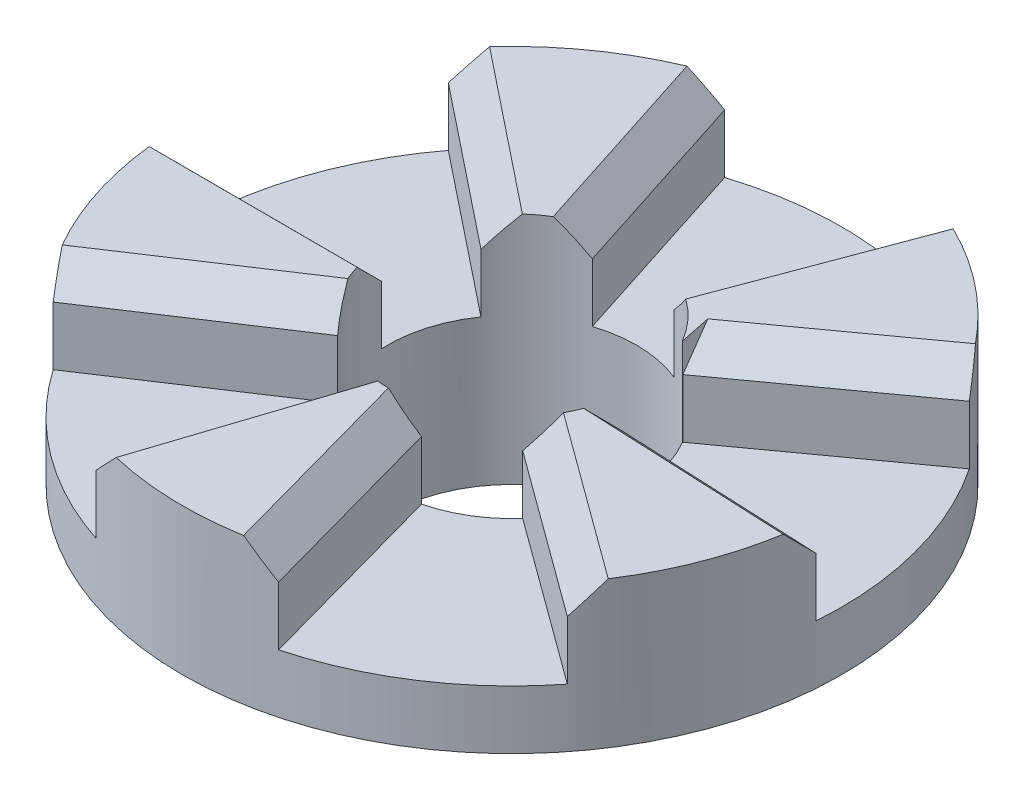
ISO-10303-21;
HEADER;
FILE_DESCRIPTION(('STEP AP214'),'2;1');
FILE_NAME('part.step','',(''),(''),'','','');
FILE_SCHEMA(('AUTOMOTIVE_DESIGN { 1 0 10303 214 1 1 1 1 }'));
ENDSEC;
DATA;
#1=APPLICATION_CONTEXT('core data for automotive mechanical design processes');
#2=APPLICATION_PROTOCOL_DEFINITION('international standard','automotive_design',2000,#1);
#3=PRODUCT_CONTEXT('',#1,'mechanical');
#4=PRODUCT('Part','Part','',(#3));
#5=PRODUCT_RELATED_PRODUCT_CATEGORY('part','',(#4));
#6=PRODUCT_DEFINITION_FORMATION('','',#4);
#7=PRODUCT_DEFINITION_CONTEXT('part definition',#1,'design');
#8=PRODUCT_DEFINITION('design','',#6,#7);
#9=PRODUCT_DEFINITION_SHAPE('','',#8);
#10=(LENGTH_UNIT() NAMED_UNIT(*) SI_UNIT(.MILLI.,.METRE.));
#11=(NAMED_UNIT(*) PLANE_ANGLE_UNIT() SI_UNIT($,.RADIAN.));
#12=(NAMED_UNIT(*) SI_UNIT($,.STERADIAN.) SOLID_ANGLE_UNIT());
#13=UNCERTAINTY_MEASURE_WITH_UNIT(LENGTH_MEASURE(1.E-05),#10,'distance_accuracy_value','');
#14=(GEOMETRIC_REPRESENTATION_CONTEXT(3) GLOBAL_UNCERTAINTY_ASSIGNED_CONTEXT((#13)) GLOBAL_UNIT_ASSIGNED_CONTEXT((#10,
#11,#12)) REPRESENTATION_CONTEXT('',''));
#15=CARTESIAN_POINT('',(0.,0.,0.));
#16=DIRECTION('',(0.,0.,1.));
#17=DIRECTION('',(1.,0.,0.));
#18=AXIS2_PLACEMENT_3D('',#15,#16,#17);
#19=CARTESIAN_POINT('',(0.,0.,0.));
#20=DIRECTION('',(0.,1.,0.));
#21=DIRECTION('',(0.,0.,1.));
#22=AXIS2_PLACEMENT_3D('',#19,#20,#21);
#23=PLANE('',#22);
#24=CARTESIAN_POINT('',(0.,0.,0.));
#25=DIRECTION('',(0.,1.,0.));
#26=DIRECTION('',(0.,0.,1.));
#27=AXIS2_PLACEMENT_3D('',#24,#25,#26);
#28=CIRCLE('',#27,11.25);
#29=CARTESIAN_POINT('',(0.,0.,11.25));
#30=VERTEX_POINT('',#29);
#31=EDGE_CURVE('E364',#30,#30,#28,.T.);
#32=ORIENTED_EDGE('',*,*,#31,.F.);
#33=EDGE_LOOP('',(#32));
#34=FACE_BOUND('',#33,.T.);
#35=CARTESIAN_POINT('',(0.,0.,0.));
#36=DIRECTION('',(0.,1.,0.));
#37=DIRECTION('',(0.,0.,1.));
#38=AXIS2_PLACEMENT_3D('',#35,#36,#37);
#39=CIRCLE('',#38,6.62076451720031);
#40=CARTESIAN_POINT('',(0.,0.,6.62076451720031));
#41=VERTEX_POINT('',#40);
#42=EDGE_CURVE('E390',#41,#41,#39,.F.);
#43=ORIENTED_EDGE('',*,*,#42,.F.);
#44=EDGE_LOOP('',(#43));
#45=FACE_BOUND('',#44,.T.);
#46=ADVANCED_FACE('F39',(#34,#45),#23,.F.);
#47=CARTESIAN_POINT('',(0.,5.,0.));
#48=DIRECTION('',(0.,1.,0.));
#49=DIRECTION('',(0.,0.,1.));
#50=AXIS2_PLACEMENT_3D('',#47,#48,#49);
#51=PLANE('',#50);
#52=CARTESIAN_POINT('',(0.,5.,0.));
#53=DIRECTION('',(0.,1.,0.));
#54=DIRECTION('',(0.,0.,1.));
#55=AXIS2_PLACEMENT_3D('',#52,#53,#54);
#56=CIRCLE('',#55,4.25);
#57=CARTESIAN_POINT('',(-2.21772566269863,5.,-3.62549208866989));
#58=VERTEX_POINT('',#57);
#59=CARTESIAN_POINT('',(-2.82302044816182,5.,-3.17695696370918));
#60=VERTEX_POINT('',#59);
#61=EDGE_CURVE('E494',#58,#60,#56,.T.);
#62=ORIENTED_EDGE('',*,*,#61,.F.);
#63=DIRECTION('',(-0.306448072952789,0.,-0.951887377048106));
#64=VECTOR('',#63,1.);
#65=CARTESIAN_POINT('',(-4.39942819776698,5.,-10.4022849188384));
#66=LINE('',#65,#64);
#67=CARTESIAN_POINT('',(-4.38578127306564,5.,-10.3598949137926));
#68=VERTEX_POINT('',#67);
#69=EDGE_CURVE('E423',#58,#68,#66,.T.);
#70=ORIENTED_EDGE('',*,*,#69,.T.);
#71=CARTESIAN_POINT('',(0.,5.,0.));
#72=DIRECTION('',(0.,1.,0.));
#73=DIRECTION('',(0.,0.,1.));
#74=AXIS2_PLACEMENT_3D('',#71,#72,#73);
#75=CIRCLE('',#74,11.25);
#76=CARTESIAN_POINT('',(-8.32818321159797,5.,-7.56332363409485));
#77=VERTEX_POINT('',#76);
#78=EDGE_CURVE('E369',#68,#77,#75,.T.);
#79=ORIENTED_EDGE('',*,*,#78,.T.);
#80=DIRECTION('',(0.782098318227316,0.,0.623155053438551));
#81=VECTOR('',#80,1.);
#82=CARTESIAN_POINT('',(-2.86487094044204,5.,-3.21030231830913));
#83=LINE('',#82,#81);
#84=EDGE_CURVE('E421',#77,#60,#83,.T.);
#85=ORIENTED_EDGE('',*,*,#84,.T.);
#86=EDGE_LOOP('',(#62,#70,#79,#85));
#87=FACE_BOUND('',#86,.T.);
#88=ADVANCED_FACE('F573',(#87),#51,.T.);
#89=CARTESIAN_POINT('',(-4.07181346345306,5.,1.21771717522682));
#90=VERTEX_POINT('',#89);
#91=CARTESIAN_POINT('',(-3.89120805293024,5.,1.70909329435547));
#92=VERTEX_POINT('',#91);
#93=EDGE_CURVE('E496',#90,#92,#56,.T.);
#94=ORIENTED_EDGE('',*,*,#93,.F.);
#95=DIRECTION('',(-0.999996355156568,0.,-0.00269993955101534));
#96=VECTOR('',#95,1.);
#97=CARTESIAN_POINT('',(-11.2509514584231,5.,1.19833386596288));
#98=LINE('',#97,#96);
#99=CARTESIAN_POINT('',(-11.1859767329973,5.,1.19850929443328));
#100=VERTEX_POINT('',#99);
#101=EDGE_CURVE('E451',#90,#100,#98,.T.);
#102=ORIENTED_EDGE('',*,*,#101,.T.);
#103=CARTESIAN_POINT('',(-9.76349954933888,5.,5.58896918492664));
#104=VERTEX_POINT('',#103);
#105=EDGE_CURVE('E366',#100,#104,#75,.T.);
#106=ORIENTED_EDGE('',*,*,#105,.T.);
#107=DIRECTION('',(0.834337345839295,0.,-0.551254200290429));
#108=VECTOR('',#107,1.);
#109=CARTESIAN_POINT('',(-3.93457760302221,5.,1.73774794678368));
#110=LINE('',#109,#108);
#111=EDGE_CURVE('E449',#104,#92,#110,.T.);
#112=ORIENTED_EDGE('',*,*,#111,.T.);
#113=EDGE_LOOP('',(#94,#102,#106,#112));
#114=FACE_BOUND('',#113,.T.);
#115=ADVANCED_FACE('F557',(#114),#51,.T.);
#116=CARTESIAN_POINT('',(-0.354113646197258,5.,4.23522177997527));
#117=VERTEX_POINT('',#116);
#118=CARTESIAN_POINT('',(0.0326870897609603,5.,4.24987429863084));
#119=VERTEX_POINT('',#118);
#120=EDGE_CURVE('E361',#117,#119,#56,.T.);
#121=ORIENTED_EDGE('',*,*,#120,.F.);
#122=DIRECTION('',(-0.311583663159981,0.,0.950218722638008));
#123=VECTOR('',#122,1.);
#124=CARTESIAN_POINT('',(-2.57111376427981,5.,10.9962791439202));
#125=LINE('',#124,#123);
#126=CARTESIAN_POINT('',(-2.55770689382485,5.,10.9553929845205));
#127=VERTEX_POINT('',#126);
#128=EDGE_CURVE('E461',#117,#127,#125,.T.);
#129=ORIENTED_EDGE('',*,*,#128,.T.);
#130=CARTESIAN_POINT('',(1.92209670396127,5.,11.0845858858426));
#131=VERTEX_POINT('',#130);
#132=EDGE_CURVE('E370',#127,#131,#75,.T.);
#133=ORIENTED_EDGE('',*,*,#132,.T.);
#134=DIRECTION('',(-0.266449480415256,0.,-0.963848885659179));
#135=VECTOR('',#134,1.);
#136=CARTESIAN_POINT('',(0.071017633608241,5.,4.3885304217966));
#137=LINE('',#136,#135);
#138=EDGE_CURVE('E459',#131,#119,#137,.T.);
#139=ORIENTED_EDGE('',*,*,#138,.T.);
#140=EDGE_LOOP('',(#121,#129,#133,#139));
#141=FACE_BOUND('',#140,.T.);
#142=ADVANCED_FACE('F535',(#141),#51,.T.);
#143=CARTESIAN_POINT('',(3.75244163910729,5.,1.99541518113245));
#144=VERTEX_POINT('',#143);
#145=CARTESIAN_POINT('',(3.96846718508751,5.,1.52110755730278));
#146=VERTEX_POINT('',#145);
#147=EDGE_CURVE('E362',#144,#146,#56,.T.);
#148=ORIENTED_EDGE('',*,*,#147,.F.);
#149=DIRECTION('',(0.807427060984501,0.,0.589967406887814));
#150=VECTOR('',#149,1.);
#151=CARTESIAN_POINT('',(9.43344057354921,5.,6.14638357423845));
#152=LINE('',#151,#150);
#153=CARTESIAN_POINT('',(9.42606450171558,5.,6.14099405711302));
#154=VERTEX_POINT('',#153);
#155=EDGE_CURVE('E471',#144,#154,#152,.T.);
#156=ORIENTED_EDGE('',*,*,#155,.T.);
#157=CARTESIAN_POINT('',(11.0987951756031,5.,1.83827246348546));
#158=VERTEX_POINT('',#157);
#159=EDGE_CURVE('E374',#154,#158,#75,.T.);
#160=ORIENTED_EDGE('',*,*,#159,.T.);
#161=DIRECTION('',(-0.999012181020673,0.,-0.0444371710656552));
#162=VECTOR('',#161,1.);
#163=CARTESIAN_POINT('',(4.17224039011066,5.,1.53017161572193));
#164=LINE('',#163,#162);
#165=EDGE_CURVE('E469',#158,#146,#164,.T.);
#166=ORIENTED_EDGE('',*,*,#165,.T.);
#167=EDGE_LOOP('',(#148,#156,#160,#166));
#168=FACE_BOUND('',#167,.T.);
#169=ADVANCED_FACE('F529',(#168),#51,.T.);
#170=DIRECTION('',(0.200951340605031,0.,0.979601224330105));
#171=VECTOR('',#170,1.);
#172=CARTESIAN_POINT('',(3.66281976973587,5.,-2.16879652959475));
#173=LINE('',#172,#171);
#174=CARTESIAN_POINT('',(3.44241618830375,5.,-3.24322388881304));
#175=VERTEX_POINT('',#174);
#176=CARTESIAN_POINT('',(3.66700674187715,5.,-2.14838580218441));
#177=VERTEX_POINT('',#176);
#178=EDGE_CURVE('E55',#175,#177,#173,.T.);
#179=ORIENTED_EDGE('',*,*,#178,.F.);
#180=DIRECTION('',(0.810601030284837,0.,-0.5855988129267));
#181=VECTOR('',#180,1.);
#182=CARTESIAN_POINT('',(8.75484439008049,5.,-7.08105721555532));
#183=LINE('',#182,#181);
#184=CARTESIAN_POINT('',(8.74668769813831,5.,-7.07516461372003));
#185=VERTEX_POINT('',#184);
#186=EDGE_CURVE('E48',#175,#185,#183,.T.);
#187=ORIENTED_EDGE('',*,*,#186,.T.);
#188=CARTESIAN_POINT('',(4.96972684778681,5.,-10.0927852973491));
#189=VERTEX_POINT('',#188);
#190=EDGE_CURVE('E478',#185,#189,#75,.T.);
#191=ORIENTED_EDGE('',*,*,#190,.T.);
#192=DIRECTION('',(-0.350974002630683,0.,0.93638520357671));
#193=VECTOR('',#192,1.);
#194=CARTESIAN_POINT('',(2.53170816625464,5.,-3.58824478346796));
#195=LINE('',#194,#193);
#196=CARTESIAN_POINT('',(2.48032529787942,5.,-3.45115725760206));
#197=VERTEX_POINT('',#196);
#198=EDGE_CURVE('E399',#189,#197,#195,.T.);
#199=ORIENTED_EDGE('',*,*,#198,.T.);
#200=EDGE_CURVE('E365',#177,#197,#56,.T.);
#201=ORIENTED_EDGE('',*,*,#200,.F.);
#202=EDGE_LOOP('',(#179,#187,#191,#199,#201));
#203=FACE_BOUND('',#202,.T.);
#204=ADVANCED_FACE('F477',(#203),#51,.T.);
#205=CARTESIAN_POINT('',(0.,5.,0.));
#206=DIRECTION('',(0.,-1.,0.));
#207=DIRECTION('',(0.,0.,-1.));
#208=AXIS2_PLACEMENT_3D('',#205,#206,#207);
#209=CYLINDRICAL_SURFACE('',#208,11.25);
#210=ORIENTED_EDGE('',*,*,#78,.F.);
#211=CARTESIAN_POINT('',(0.,4.00000000000001,0.));
#212=DIRECTION('',(0.673086019236589,0.70710678118655,-0.216691510466466));
#213=DIRECTION('',(0.673086019236594,-0.707106781186545,-0.216691510466467));
#214=AXIS2_PLACEMENT_3D('',#211,#212,#213);
#215=ELLIPSE('',#214,15.9099025766973,11.25);
#216=CARTESIAN_POINT('',(-3.44754082071887,4.,-10.7087329917912));
#217=VERTEX_POINT('',#216);
#218=EDGE_CURVE('E441',#68,#217,#215,.F.);
#219=ORIENTED_EDGE('',*,*,#218,.T.);
#220=DIRECTION('',(0.,1.,0.));
#221=VECTOR('',#220,1.);
#222=CARTESIAN_POINT('',(-3.44754082071887,2.,-10.7087329917912));
#223=LINE('',#222,#221);
#224=CARTESIAN_POINT('',(-3.44754082071887,2.,-10.7087329917912));
#225=VERTEX_POINT('',#224);
#226=EDGE_CURVE('E321',#225,#217,#223,.T.);
#227=ORIENTED_EDGE('',*,*,#226,.F.);
#228=CARTESIAN_POINT('',(0.,2.,0.));
#229=DIRECTION('',(0.,1.,0.));
#230=DIRECTION('',(0.,0.,1.));
#231=AXIS2_PLACEMENT_3D('',#228,#229,#230);
#232=CIRCLE('',#231,11.25);
#233=CARTESIAN_POINT('',(4.05245917928113,2.,-10.4947641517216));
#234=VERTEX_POINT('',#233);
#235=EDGE_CURVE('E325',#234,#225,#232,.T.);
#236=ORIENTED_EDGE('',*,*,#235,.F.);
#237=DIRECTION('',(0.,1.,0.));
#238=VECTOR('',#237,1.);
#239=CARTESIAN_POINT('',(4.05245917928113,2.,-10.4947641517216));
#240=LINE('',#239,#238);
#241=CARTESIAN_POINT('',(4.05245917928113,4.,-10.4947641517216));
#242=VERTEX_POINT('',#241);
#243=EDGE_CURVE('E322',#234,#242,#240,.T.);
#244=ORIENTED_EDGE('',*,*,#243,.T.);
#245=CARTESIAN_POINT('',(0.,3.88872656741725,0.));
#246=DIRECTION('',(-0.662124327251836,0.707106781186549,-0.248176097280341));
#247=DIRECTION('',(-0.662124327251839,-0.707106781186546,-0.248176097280342));
#248=AXIS2_PLACEMENT_3D('',#245,#246,#247);
#249=ELLIPSE('',#248,15.9099025766973,11.25);
#250=EDGE_CURVE('E396',#242,#189,#249,.F.);
#251=ORIENTED_EDGE('',*,*,#250,.T.);
#252=ORIENTED_EDGE('',*,*,#190,.F.);
#253=CARTESIAN_POINT('',(0.,4.38691420775409,0.));
#254=DIRECTION('',(0.414080891675262,0.707106781186548,0.57318148535121));
#255=DIRECTION('',(0.414080891675263,-0.707106781186547,0.573181485351211));
#256=AXIS2_PLACEMENT_3D('',#253,#254,#255);
#257=ELLIPSE('',#256,15.9099025766973,11.25);
#258=CARTESIAN_POINT('',(9.34044320300719,4.,-6.27045618527048));
#259=VERTEX_POINT('',#258);
#260=EDGE_CURVE('E425',#185,#259,#257,.F.);
#261=ORIENTED_EDGE('',*,*,#260,.T.);
#262=DIRECTION('',(0.,-1.,0.));
#263=VECTOR('',#262,1.);
#264=CARTESIAN_POINT('',(9.34044320300719,5.,-6.27045618527048));
#265=LINE('',#264,#263);
#266=CARTESIAN_POINT('',(9.34044320300719,2.,-6.27045618527048));
#267=VERTEX_POINT('',#266);
#268=EDGE_CURVE('E388',#259,#267,#265,.T.);
#269=ORIENTED_EDGE('',*,*,#268,.T.);
#270=CARTESIAN_POINT('',(0.,2.,0.));
#271=DIRECTION('',(0.,1.,0.));
#272=DIRECTION('',(0.,0.,1.));
#273=AXIS2_PLACEMENT_3D('',#270,#271,#272);
#274=CIRCLE('',#273,11.25);
#275=CARTESIAN_POINT('',(11.218400898962,2.,0.842603863134233));
#276=VERTEX_POINT('',#275);
#277=EDGE_CURVE('E334',#276,#267,#274,.T.);
#278=ORIENTED_EDGE('',*,*,#277,.F.);
#279=DIRECTION('',(0.,-1.,0.));
#280=VECTOR('',#279,1.);
#281=CARTESIAN_POINT('',(11.218400898962,5.,0.842603863134233));
#282=LINE('',#281,#280);
#283=CARTESIAN_POINT('',(11.218400898962,4.,0.842603863134233));
#284=VERTEX_POINT('',#283);
#285=EDGE_CURVE('E264',#276,#284,#282,.F.);
#286=ORIENTED_EDGE('',*,*,#285,.T.);
#287=CARTESIAN_POINT('',(0.,3.6567424767841,0.));
#288=DIRECTION('',(0.0314218249972714,0.707106781186549,-0.706408287687679));
#289=DIRECTION('',(0.0314218249972715,-0.707106781186546,-0.706408287687682));
#290=AXIS2_PLACEMENT_3D('',#287,#288,#289);
#291=ELLIPSE('',#290,15.9099025766973,11.25);
#292=EDGE_CURVE('E427',#284,#158,#291,.F.);
#293=ORIENTED_EDGE('',*,*,#292,.T.);
#294=ORIENTED_EDGE('',*,*,#159,.F.);
#295=CARTESIAN_POINT('',(0.,4.39733395182365,0.));
#296=DIRECTION('',(-0.417169954089415,0.707106781186549,0.570937150135664));
#297=DIRECTION('',(-0.417169954089417,-0.707106781186546,0.570937150135666));
#298=AXIS2_PLACEMENT_3D('',#295,#296,#297);
#299=ELLIPSE('',#298,15.9099025766973,11.25);
#300=CARTESIAN_POINT('',(8.8434731666614,4.,6.95381063522296));
#301=VERTEX_POINT('',#300);
#302=EDGE_CURVE('E429',#154,#301,#299,.F.);
#303=ORIENTED_EDGE('',*,*,#302,.T.);
#304=DIRECTION('',(0.,-1.,0.));
#305=VECTOR('',#304,1.);
#306=CARTESIAN_POINT('',(8.8434731666614,5.,6.95381063522296));
#307=LINE('',#306,#305);
#308=CARTESIAN_POINT('',(8.84347316666139,2.,6.95381063522295));
#309=VERTEX_POINT('',#308);
#310=EDGE_CURVE('E340',#301,#309,#307,.T.);
#311=ORIENTED_EDGE('',*,*,#310,.T.);
#312=CARTESIAN_POINT('',(0.,2.,0.));
#313=DIRECTION('',(0.,1.,0.));
#314=DIRECTION('',(0.,0.,1.));
#315=AXIS2_PLACEMENT_3D('',#312,#313,#314);
#316=CIRCLE('',#315,11.25);
#317=CARTESIAN_POINT('',(2.90021138671235,2.,10.8697412072406));
#318=VERTEX_POINT('',#317);
#319=EDGE_CURVE('E337',#318,#309,#316,.T.);
#320=ORIENTED_EDGE('',*,*,#319,.F.);
#321=DIRECTION('',(0.,-1.,0.));
#322=VECTOR('',#321,1.);
#323=CARTESIAN_POINT('',(2.90021138671235,5.,10.8697412072406));
#324=LINE('',#323,#322);
#325=CARTESIAN_POINT('',(2.90021138671235,4.,10.8697412072406));
#326=VERTEX_POINT('',#325);
#327=EDGE_CURVE('E342',#318,#326,#324,.F.);
#328=ORIENTED_EDGE('',*,*,#327,.T.);
#329=CARTESIAN_POINT('',(0.,3.89912861634121,0.));
#330=DIRECTION('',(0.681544083088702,0.707106781186548,-0.188408234445259));
#331=DIRECTION('',(0.681544083088703,-0.707106781186547,-0.188408234445259));
#332=AXIS2_PLACEMENT_3D('',#329,#330,#331);
#333=ELLIPSE('',#332,15.9099025766973,11.25);
#334=EDGE_CURVE('E431',#326,#131,#333,.F.);
#335=ORIENTED_EDGE('',*,*,#334,.T.);
#336=ORIENTED_EDGE('',*,*,#132,.F.);
#337=CARTESIAN_POINT('',(0.,4.01685950005862,0.));
#338=DIRECTION('',(-0.671906102387752,0.70710678118655,-0.220322921127367));
#339=DIRECTION('',(-0.671906102387757,-0.707106781186545,-0.220322921127369));
#340=AXIS2_PLACEMENT_3D('',#337,#338,#339);
#341=ELLIPSE('',#340,15.9099025766973,11.25);
#342=CARTESIAN_POINT('',(-3.52133248691783,4.,10.6846954807602));
#343=VERTEX_POINT('',#342);
#344=EDGE_CURVE('E433',#127,#343,#341,.F.);
#345=ORIENTED_EDGE('',*,*,#344,.T.);
#346=DIRECTION('',(0.,-1.,0.));
#347=VECTOR('',#346,1.);
#348=CARTESIAN_POINT('',(-3.52133248691783,5.,10.6846954807602));
#349=LINE('',#348,#347);
#350=CARTESIAN_POINT('',(-3.52133248691783,2.,10.6846954807602));
#351=VERTEX_POINT('',#350);
#352=EDGE_CURVE('E348',#343,#351,#349,.T.);
#353=ORIENTED_EDGE('',*,*,#352,.T.);
#354=CARTESIAN_POINT('',(0.,2.,0.));
#355=DIRECTION('',(0.,1.,0.));
#356=DIRECTION('',(0.,0.,1.));
#357=AXIS2_PLACEMENT_3D('',#354,#355,#356);
#358=CIRCLE('',#357,11.25);
#359=CARTESIAN_POINT('',(-9.22851254532332,2.,6.43405441388322));
#360=VERTEX_POINT('',#359);
#361=EDGE_CURVE('E345',#360,#351,#358,.T.);
#362=ORIENTED_EDGE('',*,*,#361,.F.);
#363=DIRECTION('',(0.,-1.,0.));
#364=VECTOR('',#363,1.);
#365=CARTESIAN_POINT('',(-9.22851254532332,5.,6.43405441388322));
#366=LINE('',#365,#364);
#367=CARTESIAN_POINT('',(-9.22851254532332,4.,6.43405441388322));
#368=VERTEX_POINT('',#367);
#369=EDGE_CURVE('E350',#360,#368,#366,.F.);
#370=ORIENTED_EDGE('',*,*,#369,.T.);
#371=CARTESIAN_POINT('',(0.,4.28091557962254,0.));
#372=DIRECTION('',(0.389795583182929,0.707106781186548,0.589965595040151));
#373=DIRECTION('',(0.38979558318293,-0.707106781186547,0.589965595040152));
#374=AXIS2_PLACEMENT_3D('',#371,#372,#373);
#375=ELLIPSE('',#374,15.9099025766973,11.25);
#376=EDGE_CURVE('E435',#368,#104,#375,.F.);
#377=ORIENTED_EDGE('',*,*,#376,.T.);
#378=ORIENTED_EDGE('',*,*,#105,.F.);
#379=CARTESIAN_POINT('',(0.,3.7712936129473,0.));
#380=DIRECTION('',(0.0019091455653167,0.70710678118655,-0.707104203893038));
#381=DIRECTION('',(0.00190914556531672,-0.707106781186545,-0.707104203893043));
#382=AXIS2_PLACEMENT_3D('',#379,#380,#381);
#383=ELLIPSE('',#382,15.9099025766973,11.25);
#384=CARTESIAN_POINT('',(-11.248251518872,4.,0.198337510806303));
#385=VERTEX_POINT('',#384);
#386=EDGE_CURVE('E437',#100,#385,#383,.F.);
#387=ORIENTED_EDGE('',*,*,#386,.T.);
#388=DIRECTION('',(0.,-1.,0.));
#389=VECTOR('',#388,1.);
#390=CARTESIAN_POINT('',(-11.248251518872,5.,0.198337510806303));
#391=LINE('',#390,#389);
#392=CARTESIAN_POINT('',(-11.248251518872,2.,0.198337510806303));
#393=VERTEX_POINT('',#392);
#394=EDGE_CURVE('E356',#385,#393,#391,.T.);
#395=ORIENTED_EDGE('',*,*,#394,.T.);
#396=CARTESIAN_POINT('',(0.,2.,0.));
#397=DIRECTION('',(0.,1.,0.));
#398=DIRECTION('',(0.,0.,1.));
#399=AXIS2_PLACEMENT_3D('',#396,#397,#398);
#400=CIRCLE('',#399,11.25);
#401=CARTESIAN_POINT('',(-8.96703458527312,2.,-6.79373172464999));
#402=VERTEX_POINT('',#401);
#403=EDGE_CURVE('E353',#402,#393,#400,.T.);
#404=ORIENTED_EDGE('',*,*,#403,.F.);
#405=DIRECTION('',(0.,-1.,0.));
#406=VECTOR('',#405,1.);
#407=CARTESIAN_POINT('',(-8.96703458527312,5.,-6.79373172464999));
#408=LINE('',#407,#406);
#409=CARTESIAN_POINT('',(-8.96703458527312,4.,-6.79373172464999));
#410=VERTEX_POINT('',#409);
#411=EDGE_CURVE('E358',#402,#410,#408,.F.);
#412=ORIENTED_EDGE('',*,*,#411,.T.);
#413=CARTESIAN_POINT('',(0.,4.27448675983489,0.));
#414=DIRECTION('',(-0.440637164017064,0.707106781186549,0.553027024373128));
#415=DIRECTION('',(-0.440637164017066,-0.707106781186546,0.553027024373131));
#416=AXIS2_PLACEMENT_3D('',#413,#414,#415);
#417=ELLIPSE('',#416,15.9099025766973,11.25);
#418=EDGE_CURVE('E439',#410,#77,#417,.F.);
#419=ORIENTED_EDGE('',*,*,#418,.T.);
#420=EDGE_LOOP('',(#210,#219,#227,#236,#244,#251,#252,#261,#269,#278,#286,#293,#294,#303,#311,
#320,#328,#335,#336,#345,#353,#362,#370,#377,#378,#387,#395,#404,#412,#419));
#421=FACE_BOUND('',#420,.T.);
#422=ORIENTED_EDGE('',*,*,#31,.T.);
#423=EDGE_LOOP('',(#422));
#424=FACE_BOUND('',#423,.T.);
#425=ADVANCED_FACE('F482',(#421,#424),#209,.T.);
#426=CARTESIAN_POINT('',(0.,5.,0.));
#427=DIRECTION('',(0.,-1.,0.));
#428=DIRECTION('',(0.,0.,-1.));
#429=AXIS2_PLACEMENT_3D('',#426,#427,#428);
#430=CYLINDRICAL_SURFACE('',#429,4.25);
#431=DIRECTION('',(0.,1.,0.));
#432=VECTOR('',#431,1.);
#433=CARTESIAN_POINT('',(-1.30240431004935,2.,-4.04552135245445));
#434=LINE('',#433,#432);
#435=CARTESIAN_POINT('',(-1.30240431004935,2.,-4.04552135245445));
#436=VERTEX_POINT('',#435);
#437=CARTESIAN_POINT('',(-1.30240431004935,4.,-4.04552135245445));
#438=VERTEX_POINT('',#437);
#439=EDGE_CURVE('E329',#436,#438,#434,.T.);
#440=ORIENTED_EDGE('',*,*,#439,.T.);
#441=CARTESIAN_POINT('',(0.,4.00000000000001,0.));
#442=DIRECTION('',(0.673086019236589,0.70710678118655,-0.216691510466466));
#443=DIRECTION('',(0.673086019236594,-0.707106781186545,-0.216691510466467));
#444=AXIS2_PLACEMENT_3D('',#441,#442,#443);
#445=ELLIPSE('',#444,6.01040764008563,4.25);
#446=EDGE_CURVE('E419',#438,#58,#445,.T.);
#447=ORIENTED_EDGE('',*,*,#446,.T.);
#448=ORIENTED_EDGE('',*,*,#61,.T.);
#449=CARTESIAN_POINT('',(0.,4.27448675983489,0.));
#450=DIRECTION('',(-0.440637164017064,0.707106781186549,0.553027024373128));
#451=DIRECTION('',(-0.440637164017066,-0.707106781186546,0.553027024373131));
#452=AXIS2_PLACEMENT_3D('',#449,#450,#451);
#453=ELLIPSE('',#452,6.01040764008564,4.25);
#454=CARTESIAN_POINT('',(-3.48802599388059,4.,-2.42820400008181));
#455=VERTEX_POINT('',#454);
#456=EDGE_CURVE('E417',#60,#455,#453,.T.);
#457=ORIENTED_EDGE('',*,*,#456,.T.);
#458=DIRECTION('',(0.,1.,0.));
#459=VECTOR('',#458,1.);
#460=CARTESIAN_POINT('',(-3.48802599388059,2.,-2.42820400008181));
#461=LINE('',#460,#459);
#462=CARTESIAN_POINT('',(-3.48802599388059,2.,-2.42820400008181));
#463=VERTEX_POINT('',#462);
#464=EDGE_CURVE('E308',#463,#455,#461,.T.);
#465=ORIENTED_EDGE('',*,*,#464,.F.);
#466=CARTESIAN_POINT('',(0.,2.,0.));
#467=DIRECTION('',(0.,1.,0.));
#468=DIRECTION('',(0.,0.,1.));
#469=AXIS2_PLACEMENT_3D('',#466,#467,#468);
#470=CIRCLE('',#469,4.25);
#471=CARTESIAN_POINT('',(-4.24444384473201,2.,0.217247437077139));
#472=VERTEX_POINT('',#471);
#473=EDGE_CURVE('E383',#463,#472,#470,.T.);
#474=ORIENTED_EDGE('',*,*,#473,.T.);
#475=DIRECTION('',(0.,-1.,0.));
#476=VECTOR('',#475,1.);
#477=CARTESIAN_POINT('',(-4.24444384473201,5.,0.217247437077139));
#478=LINE('',#477,#476);
#479=CARTESIAN_POINT('',(-4.24444384473201,4.,0.217247437077139));
#480=VERTEX_POINT('',#479);
#481=EDGE_CURVE('E386',#480,#472,#478,.T.);
#482=ORIENTED_EDGE('',*,*,#481,.F.);
#483=CARTESIAN_POINT('',(0.,3.7712936129473,0.));
#484=DIRECTION('',(0.0019091455653167,0.70710678118655,-0.707104203893038));
#485=DIRECTION('',(0.00190914556531672,-0.707106781186545,-0.707104203893043));
#486=AXIS2_PLACEMENT_3D('',#483,#484,#485);
#487=ELLIPSE('',#486,6.01040764008563,4.25);
#488=EDGE_CURVE('E415',#480,#90,#487,.T.);
#489=ORIENTED_EDGE('',*,*,#488,.T.);
#490=ORIENTED_EDGE('',*,*,#93,.T.);
#491=CARTESIAN_POINT('',(0.,4.28091557962254,0.));
#492=DIRECTION('',(0.389795583182929,0.707106781186548,0.589965595040151));
#493=DIRECTION('',(0.38979558318293,-0.707106781186547,0.589965595040152));
#494=AXIS2_PLACEMENT_3D('',#491,#492,#493);
#495=ELLIPSE('',#494,6.01040764008565,4.25);
#496=CARTESIAN_POINT('',(-3.38332340273179,4.,2.57208529262298));
#497=VERTEX_POINT('',#496);
#498=EDGE_CURVE('E413',#92,#497,#495,.T.);
#499=ORIENTED_EDGE('',*,*,#498,.T.);
#500=DIRECTION('',(0.,1.,0.));
#501=VECTOR('',#500,1.);
#502=CARTESIAN_POINT('',(-3.38332340273179,2.,2.57208529262298));
#503=LINE('',#502,#501);
#504=CARTESIAN_POINT('',(-3.38332340273179,2.,2.57208529262298));
#505=VERTEX_POINT('',#504);
#506=EDGE_CURVE('E300',#505,#497,#503,.T.);
#507=ORIENTED_EDGE('',*,*,#506,.F.);
#508=CARTESIAN_POINT('',(0.,2.,0.));
#509=DIRECTION('',(0.,1.,0.));
#510=DIRECTION('',(0.,0.,1.));
#511=AXIS2_PLACEMENT_3D('',#508,#509,#510);
#512=CIRCLE('',#511,4.25);
#513=CARTESIAN_POINT('',(-1.34024036154073,2.,4.03314465067857));
#514=VERTEX_POINT('',#513);
#515=EDGE_CURVE('E380',#505,#514,#512,.T.);
#516=ORIENTED_EDGE('',*,*,#515,.T.);
#517=DIRECTION('',(0.,1.,0.));
#518=VECTOR('',#517,1.);
#519=CARTESIAN_POINT('',(-1.34024036154073,2.,4.03314465067857));
#520=LINE('',#519,#518);
#521=CARTESIAN_POINT('',(-1.34024036154073,4.,4.03314465067857));
#522=VERTEX_POINT('',#521);
#523=EDGE_CURVE('E296',#514,#522,#520,.T.);
#524=ORIENTED_EDGE('',*,*,#523,.T.);
#525=CARTESIAN_POINT('',(0.,4.01685950005862,0.));
#526=DIRECTION('',(-0.671906102387752,0.70710678118655,-0.220322921127367));
#527=DIRECTION('',(-0.671906102387757,-0.707106781186545,-0.220322921127369));
#528=AXIS2_PLACEMENT_3D('',#525,#526,#527);
#529=ELLIPSE('',#528,6.01040764008563,4.25);
#530=EDGE_CURVE('E411',#522,#117,#529,.T.);
#531=ORIENTED_EDGE('',*,*,#530,.T.);
#532=ORIENTED_EDGE('',*,*,#120,.T.);
#533=CARTESIAN_POINT('',(0.,3.89912861634121,0.));
#534=DIRECTION('',(0.681544083088702,0.707106781186548,-0.188408234445259));
#535=DIRECTION('',(0.681544083088703,-0.707106781186547,-0.188408234445259));
#536=AXIS2_PLACEMENT_3D('',#533,#534,#535);
#537=ELLIPSE('',#536,6.01040764008565,4.25);
#538=CARTESIAN_POINT('',(1.03486651926743,4.,4.12208094138135));
#539=VERTEX_POINT('',#538);
#540=EDGE_CURVE('E409',#119,#539,#537,.T.);
#541=ORIENTED_EDGE('',*,*,#540,.T.);
#542=DIRECTION('',(0.,1.,0.));
#543=VECTOR('',#542,1.);
#544=CARTESIAN_POINT('',(1.03486651926743,2.,4.12208094138135));
#545=LINE('',#544,#543);
#546=CARTESIAN_POINT('',(1.03486651926743,2.,4.12208094138135));
#547=VERTEX_POINT('',#546);
#548=EDGE_CURVE('E290',#547,#539,#545,.T.);
#549=ORIENTED_EDGE('',*,*,#548,.F.);
#550=CARTESIAN_POINT('',(0.,2.,0.));
#551=DIRECTION('',(0.,1.,0.));
#552=DIRECTION('',(0.,0.,1.));
#553=AXIS2_PLACEMENT_3D('',#550,#551,#552);
#554=CIRCLE('',#553,4.25);
#555=CARTESIAN_POINT('',(3.18212131365326,2.,2.81719788889485));
#556=VERTEX_POINT('',#555);
#557=EDGE_CURVE('E377',#547,#556,#554,.T.);
#558=ORIENTED_EDGE('',*,*,#557,.T.);
#559=DIRECTION('',(0.,1.,0.));
#560=VECTOR('',#559,1.);
#561=CARTESIAN_POINT('',(3.18212131365327,2.,2.81719788889485));
#562=LINE('',#561,#560);
#563=CARTESIAN_POINT('',(3.18212131365327,4.,2.81719788889485));
#564=VERTEX_POINT('',#563);
#565=EDGE_CURVE('E287',#556,#564,#562,.T.);
#566=ORIENTED_EDGE('',*,*,#565,.T.);
#567=CARTESIAN_POINT('',(0.,4.39733395182365,0.));
#568=DIRECTION('',(-0.417169954089415,0.707106781186549,0.570937150135664));
#569=DIRECTION('',(-0.417169954089417,-0.707106781186546,0.570937150135666));
#570=AXIS2_PLACEMENT_3D('',#567,#568,#569);
#571=ELLIPSE('',#570,6.01040764008564,4.25);
#572=EDGE_CURVE('E407',#564,#144,#571,.T.);
#573=ORIENTED_EDGE('',*,*,#572,.T.);
#574=ORIENTED_EDGE('',*,*,#147,.T.);
#575=CARTESIAN_POINT('',(0.,3.6567424767841,0.));
#576=DIRECTION('',(0.0314218249972714,0.707106781186549,-0.706408287687679));
#577=DIRECTION('',(0.0314218249972715,-0.707106781186546,-0.706408287687682));
#578=AXIS2_PLACEMENT_3D('',#575,#576,#577);
#579=ELLIPSE('',#578,6.01040764008564,4.25);
#580=CARTESIAN_POINT('',(4.21667756117632,4.,0.531159434701248));
#581=VERTEX_POINT('',#580);
#582=EDGE_CURVE('E272',#146,#581,#579,.T.);
#583=ORIENTED_EDGE('',*,*,#582,.T.);
#584=DIRECTION('',(0.,1.,0.));
#585=VECTOR('',#584,1.);
#586=CARTESIAN_POINT('',(4.21667756117632,2.,0.531159434701248));
#587=LINE('',#586,#585);
#588=CARTESIAN_POINT('',(4.21667756117632,2.,0.531159434701248));
#589=VERTEX_POINT('',#588);
#590=EDGE_CURVE('E261',#589,#581,#587,.T.);
#591=ORIENTED_EDGE('',*,*,#590,.F.);
#592=CARTESIAN_POINT('',(0.,2.,0.));
#593=DIRECTION('',(0.,1.,0.));
#594=DIRECTION('',(0.,0.,1.));
#595=AXIS2_PLACEMENT_3D('',#592,#593,#594);
#596=CIRCLE('',#595,4.25);
#597=CARTESIAN_POINT('',(3.66700674187715,2.,-2.14838580218441));
#598=VERTEX_POINT('',#597);
#599=EDGE_CURVE('E242',#589,#598,#596,.T.);
#600=ORIENTED_EDGE('',*,*,#599,.T.);
#601=DIRECTION('',(0.,-1.,0.));
#602=VECTOR('',#601,1.);
#603=CARTESIAN_POINT('',(3.66700674187714,5.,-2.14838580218441));
#604=LINE('',#603,#602);
#605=EDGE_CURVE('E254',#177,#598,#604,.T.);
#606=ORIENTED_EDGE('',*,*,#605,.F.);
#607=ORIENTED_EDGE('',*,*,#200,.T.);
#608=CARTESIAN_POINT('',(0.,3.88872656741725,0.));
#609=DIRECTION('',(-0.662124327251836,0.707106781186549,-0.248176097280341));
#610=DIRECTION('',(-0.662124327251839,-0.707106781186546,-0.248176097280342));
#611=AXIS2_PLACEMENT_3D('',#608,#609,#610);
#612=ELLIPSE('',#611,6.01040764008564,4.25);
#613=CARTESIAN_POINT('',(1.59532296267792,4.,-3.93921878609865));
#614=VERTEX_POINT('',#613);
#615=EDGE_CURVE('E401',#197,#614,#612,.T.);
#616=ORIENTED_EDGE('',*,*,#615,.T.);
#617=DIRECTION('',(0.,1.,0.));
#618=VECTOR('',#617,1.);
#619=CARTESIAN_POINT('',(1.59532296267792,2.,-3.93921878609865));
#620=LINE('',#619,#618);
#621=CARTESIAN_POINT('',(1.59532296267792,2.,-3.93921878609865));
#622=VERTEX_POINT('',#621);
#623=EDGE_CURVE('E326',#622,#614,#620,.T.);
#624=ORIENTED_EDGE('',*,*,#623,.F.);
#625=CARTESIAN_POINT('',(0.,2.,0.));
#626=DIRECTION('',(0.,1.,0.));
#627=DIRECTION('',(0.,0.,1.));
#628=AXIS2_PLACEMENT_3D('',#625,#626,#627);
#629=CIRCLE('',#628,4.25);
#630=EDGE_CURVE('E255',#622,#436,#629,.T.);
#631=ORIENTED_EDGE('',*,*,#630,.T.);
#632=EDGE_LOOP('',(#440,#447,#448,#457,#465,#474,#482,#489,#490,#499,#507,#516,#524,#531,#532,
#541,#549,#558,#566,#573,#574,#583,#591,#600,#606,#607,#616,#624,#631));
#633=FACE_BOUND('',#632,.T.);
#634=CARTESIAN_POINT('',(0.,-3.,0.));
#635=DIRECTION('',(0.,-1.,0.));
#636=DIRECTION('',(0.,0.,-1.));
#637=AXIS2_PLACEMENT_3D('',#634,#635,#636);
#638=CIRCLE('',#637,4.25);
#639=CARTESIAN_POINT('',(0.,-3.,-4.25));
#640=VERTEX_POINT('',#639);
#641=EDGE_CURVE('E992',#640,#640,#638,.T.);
#642=ORIENTED_EDGE('',*,*,#641,.T.);
#643=EDGE_LOOP('',(#642));
#644=FACE_BOUND('',#643,.T.);
#645=ADVANCED_FACE('F268',(#633,#644),#430,.F.);
#646=CARTESIAN_POINT('',(0.,2.,0.));
#647=DIRECTION('',(0.,1.,0.));
#648=DIRECTION('',(0.,0.,1.));
#649=AXIS2_PLACEMENT_3D('',#646,#647,#648);
#650=PLANE('',#649);
#651=ORIENTED_EDGE('',*,*,#235,.T.);
#652=DIRECTION('',(0.306448072952789,0.,0.951887377048106));
#653=VECTOR('',#652,1.);
#654=CARTESIAN_POINT('',(-1.30240431004935,2.,-4.04552135245445));
#655=LINE('',#654,#653);
#656=EDGE_CURVE('E282',#225,#436,#655,.T.);
#657=ORIENTED_EDGE('',*,*,#656,.T.);
#658=ORIENTED_EDGE('',*,*,#630,.F.);
#659=DIRECTION('',(0.350974002630683,0.,-0.93638520357671));
#660=VECTOR('',#659,1.);
#661=CARTESIAN_POINT('',(1.59532296267792,2.,-3.93921878609865));
#662=LINE('',#661,#660);
#663=EDGE_CURVE('E318',#622,#234,#662,.T.);
#664=ORIENTED_EDGE('',*,*,#663,.T.);
#665=EDGE_LOOP('',(#651,#657,#658,#664));
#666=FACE_BOUND('',#665,.T.);
#667=ADVANCED_FACE('F789',(#666),#650,.T.);
#668=CARTESIAN_POINT('',(1.59532296267792,2.,-3.93921878609865));
#669=DIRECTION('',(0.93638520357671,0.,0.350974002630683));
#670=DIRECTION('',(0.350974002630683,0.,-0.93638520357671));
#671=AXIS2_PLACEMENT_3D('',#668,#669,#670);
#672=PLANE('',#671);
#673=ORIENTED_EDGE('',*,*,#623,.T.);
#674=DIRECTION('',(0.350974002630683,0.,-0.93638520357671));
#675=VECTOR('',#674,1.);
#676=CARTESIAN_POINT('',(4.05245917928113,4.,-10.4947641517216));
#677=LINE('',#676,#675);
#678=EDGE_CURVE('E393',#614,#242,#677,.T.);
#679=ORIENTED_EDGE('',*,*,#678,.T.);
#680=ORIENTED_EDGE('',*,*,#243,.F.);
#681=ORIENTED_EDGE('',*,*,#663,.F.);
#682=EDGE_LOOP('',(#673,#679,#680,#681));
#683=FACE_BOUND('',#682,.T.);
#684=ADVANCED_FACE('F776',(#683),#672,.F.);
#685=CARTESIAN_POINT('',(-1.30240431004935,2.,-4.04552135245445));
#686=DIRECTION('',(-0.951887377048106,0.,0.306448072952789));
#687=DIRECTION('',(0.306448072952789,0.,0.951887377048106));
#688=AXIS2_PLACEMENT_3D('',#685,#686,#687);
#689=PLANE('',#688);
#690=ORIENTED_EDGE('',*,*,#226,.T.);
#691=DIRECTION('',(0.306448072952789,0.,0.951887377048106));
#692=VECTOR('',#691,1.);
#693=CARTESIAN_POINT('',(-1.30240431004935,4.,-4.04552135245445));
#694=LINE('',#693,#692);
#695=EDGE_CURVE('E403',#217,#438,#694,.T.);
#696=ORIENTED_EDGE('',*,*,#695,.T.);
#697=ORIENTED_EDGE('',*,*,#439,.F.);
#698=ORIENTED_EDGE('',*,*,#656,.F.);
#699=EDGE_LOOP('',(#690,#696,#697,#698));
#700=FACE_BOUND('',#699,.T.);
#701=ADVANCED_FACE('F766',(#700),#689,.F.);
#702=CARTESIAN_POINT('',(3.66281976973587,2.,-2.16879652959475));
#703=DIRECTION('',(-0.5855988129267,0.,-0.810601030284837));
#704=DIRECTION('',(-0.810601030284837,0.,0.5855988129267));
#705=AXIS2_PLACEMENT_3D('',#702,#703,#704);
#706=PLANE('',#705);
#707=ORIENTED_EDGE('',*,*,#268,.F.);
#708=DIRECTION('',(-0.810601030284837,0.,0.5855988129267));
#709=VECTOR('',#708,1.);
#710=CARTESIAN_POINT('',(3.66281976973587,4.,-2.16879652959475));
#711=LINE('',#710,#709);
#712=CARTESIAN_POINT('',(3.66281976973587,4.,-2.16879652959475));
#713=VERTEX_POINT('',#712);
#714=EDGE_CURVE('E475',#259,#713,#711,.T.);
#715=ORIENTED_EDGE('',*,*,#714,.T.);
#716=DIRECTION('',(0.,1.,0.));
#717=VECTOR('',#716,1.);
#718=CARTESIAN_POINT('',(3.66281976973587,2.,-2.16879652959475));
#719=LINE('',#718,#717);
#720=CARTESIAN_POINT('',(3.66281976973587,2.,-2.16879652959475));
#721=VERTEX_POINT('',#720);
#722=EDGE_CURVE('E265',#721,#713,#719,.T.);
#723=ORIENTED_EDGE('',*,*,#722,.F.);
#724=DIRECTION('',(-0.810601030284837,0.,0.5855988129267));
#725=VECTOR('',#724,1.);
#726=CARTESIAN_POINT('',(3.66281976973587,2.,-2.16879652959475));
#727=LINE('',#726,#725);
#728=EDGE_CURVE('E283',#267,#721,#727,.T.);
#729=ORIENTED_EDGE('',*,*,#728,.F.);
#730=EDGE_LOOP('',(#707,#715,#723,#729));
#731=FACE_BOUND('',#730,.T.);
#732=ADVANCED_FACE('F488',(#731),#706,.F.);
#733=CARTESIAN_POINT('',(4.21667756117632,2.,0.531159434701248));
#734=DIRECTION('',(-0.0444371710656552,0.,0.999012181020673));
#735=DIRECTION('',(0.999012181020673,0.,0.0444371710656552));
#736=AXIS2_PLACEMENT_3D('',#733,#734,#735);
#737=PLANE('',#736);
#738=ORIENTED_EDGE('',*,*,#590,.T.);
#739=DIRECTION('',(0.999012181020673,0.,0.0444371710656552));
#740=VECTOR('',#739,1.);
#741=CARTESIAN_POINT('',(11.218400898962,4.,0.842603863134233));
#742=LINE('',#741,#740);
#743=EDGE_CURVE('E473',#581,#284,#742,.T.);
#744=ORIENTED_EDGE('',*,*,#743,.T.);
#745=ORIENTED_EDGE('',*,*,#285,.F.);
#746=DIRECTION('',(0.999012181020673,0.,0.0444371710656552));
#747=VECTOR('',#746,1.);
#748=CARTESIAN_POINT('',(4.21667756117632,2.,0.531159434701248));
#749=LINE('',#748,#747);
#750=EDGE_CURVE('E246',#589,#276,#749,.T.);
#751=ORIENTED_EDGE('',*,*,#750,.F.);
#752=EDGE_LOOP('',(#738,#744,#745,#751));
#753=FACE_BOUND('',#752,.T.);
#754=ADVANCED_FACE('F259',(#753),#737,.F.);
#755=CARTESIAN_POINT('',(-0.00979011459624368,2.,0.343161459621623));
#756=DIRECTION('',(0.,1.,0.));
#757=DIRECTION('',(0.,0.,1.));
#758=AXIS2_PLACEMENT_3D('',#755,#756,#757);
#759=PLANE('',#758);
#760=ORIENTED_EDGE('',*,*,#277,.T.);
#761=ORIENTED_EDGE('',*,*,#728,.T.);
#762=DIRECTION('',(0.200951340605031,0.,0.979601224330105));
#763=VECTOR('',#762,1.);
#764=CARTESIAN_POINT('',(3.66281976973587,2.,-2.16879652959475));
#765=LINE('',#764,#763);
#766=EDGE_CURVE('E249',#721,#598,#765,.T.);
#767=ORIENTED_EDGE('',*,*,#766,.T.);
#768=ORIENTED_EDGE('',*,*,#599,.F.);
#769=ORIENTED_EDGE('',*,*,#750,.T.);
#770=EDGE_LOOP('',(#760,#761,#767,#768,#769));
#771=FACE_BOUND('',#770,.T.);
#772=ADVANCED_FACE('F245',(#771),#759,.T.);
#773=CARTESIAN_POINT('',(3.66281976973587,2.,-2.16879652959475));
#774=DIRECTION('',(-0.979601224330105,0.,0.200951340605031));
#775=DIRECTION('',(0.200951340605031,0.,0.979601224330105));
#776=AXIS2_PLACEMENT_3D('',#773,#774,#775);
#777=PLANE('',#776);
#778=ORIENTED_EDGE('',*,*,#605,.T.);
#779=ORIENTED_EDGE('',*,*,#766,.F.);
#780=ORIENTED_EDGE('',*,*,#722,.T.);
#781=DIRECTION('',(-0.148495799722423,0.673744948959284,-0.723890006296986));
#782=VECTOR('',#781,1.);
#783=CARTESIAN_POINT('',(3.86291635974517,3.0921354875037,-1.19336205890535));
#784=LINE('',#783,#782);
#785=EDGE_CURVE('E11',#713,#175,#784,.T.);
#786=ORIENTED_EDGE('',*,*,#785,.T.);
#787=ORIENTED_EDGE('',*,*,#178,.T.);
#788=EDGE_LOOP('',(#778,#779,#780,#786,#787));
#789=FACE_BOUND('',#788,.T.);
#790=ADVANCED_FACE('F491',(#789),#777,.F.);
#791=CARTESIAN_POINT('',(1.03486651926743,2.,4.12208094138135));
#792=DIRECTION('',(-0.963848885659179,0.,0.266449480415256));
#793=DIRECTION('',(0.266449480415256,0.,0.963848885659179));
#794=AXIS2_PLACEMENT_3D('',#791,#792,#793);
#795=PLANE('',#794);
#796=ORIENTED_EDGE('',*,*,#548,.T.);
#797=DIRECTION('',(0.266449480415256,0.,0.963848885659179));
#798=VECTOR('',#797,1.);
#799=CARTESIAN_POINT('',(2.90021138671235,4.,10.8697412072406));
#800=LINE('',#799,#798);
#801=EDGE_CURVE('E463',#539,#326,#800,.T.);
#802=ORIENTED_EDGE('',*,*,#801,.T.);
#803=ORIENTED_EDGE('',*,*,#327,.F.);
#804=DIRECTION('',(0.266449480415256,0.,0.963848885659179));
#805=VECTOR('',#804,1.);
#806=CARTESIAN_POINT('',(1.03486651926743,2.,4.12208094138135));
#807=LINE('',#806,#805);
#808=EDGE_CURVE('E278',#547,#318,#807,.T.);
#809=ORIENTED_EDGE('',*,*,#808,.F.);
#810=EDGE_LOOP('',(#796,#802,#803,#809));
#811=FACE_BOUND('',#810,.T.);
#812=ADVANCED_FACE('F513',(#811),#795,.F.);
#813=CARTESIAN_POINT('',(3.18212131365327,2.,2.81719788889485));
#814=DIRECTION('',(0.589967406887814,0.,-0.807427060984501));
#815=DIRECTION('',(-0.807427060984501,0.,-0.589967406887814));
#816=AXIS2_PLACEMENT_3D('',#813,#814,#815);
#817=PLANE('',#816);
#818=ORIENTED_EDGE('',*,*,#310,.F.);
#819=DIRECTION('',(-0.807427060984501,0.,-0.589967406887814));
#820=VECTOR('',#819,1.);
#821=CARTESIAN_POINT('',(3.18212131365327,4.,2.81719788889485));
#822=LINE('',#821,#820);
#823=EDGE_CURVE('E466',#301,#564,#822,.T.);
#824=ORIENTED_EDGE('',*,*,#823,.T.);
#825=ORIENTED_EDGE('',*,*,#565,.F.);
#826=DIRECTION('',(-0.807427060984501,0.,-0.589967406887813));
#827=VECTOR('',#826,1.);
#828=CARTESIAN_POINT('',(3.18212131365327,2.,2.81719788889485));
#829=LINE('',#828,#827);
#830=EDGE_CURVE('E273',#309,#556,#829,.T.);
#831=ORIENTED_EDGE('',*,*,#830,.F.);
#832=EDGE_LOOP('',(#818,#824,#825,#831));
#833=FACE_BOUND('',#832,.T.);
#834=ADVANCED_FACE('F523',(#833),#817,.F.);
#835=CARTESIAN_POINT('',(-0.00979011459624368,2.,0.343161459621623));
#836=DIRECTION('',(0.,1.,0.));
#837=DIRECTION('',(0.,0.,1.));
#838=AXIS2_PLACEMENT_3D('',#835,#836,#837);
#839=PLANE('',#838);
#840=ORIENTED_EDGE('',*,*,#319,.T.);
#841=ORIENTED_EDGE('',*,*,#830,.T.);
#842=ORIENTED_EDGE('',*,*,#557,.F.);
#843=ORIENTED_EDGE('',*,*,#808,.T.);
#844=EDGE_LOOP('',(#840,#841,#842,#843));
#845=FACE_BOUND('',#844,.T.);
#846=ADVANCED_FACE('F521',(#845),#839,.T.);
#847=CARTESIAN_POINT('',(-3.38332340273179,2.,2.57208529262298));
#848=DIRECTION('',(-0.551254200290428,0.,-0.834337345839295));
#849=DIRECTION('',(-0.834337345839296,0.,0.551254200290429));
#850=AXIS2_PLACEMENT_3D('',#847,#848,#849);
#851=PLANE('',#850);
#852=ORIENTED_EDGE('',*,*,#506,.T.);
#853=DIRECTION('',(-0.834337345839296,0.,0.551254200290429));
#854=VECTOR('',#853,1.);
#855=CARTESIAN_POINT('',(-9.22851254532332,4.,6.43405441388323));
#856=LINE('',#855,#854);
#857=EDGE_CURVE('E453',#497,#368,#856,.T.);
#858=ORIENTED_EDGE('',*,*,#857,.T.);
#859=ORIENTED_EDGE('',*,*,#369,.F.);
#860=DIRECTION('',(-0.834337345839296,0.,0.551254200290429));
#861=VECTOR('',#860,1.);
#862=CARTESIAN_POINT('',(-3.38332340273179,2.,2.57208529262298));
#863=LINE('',#862,#861);
#864=EDGE_CURVE('E299',#505,#360,#863,.T.);
#865=ORIENTED_EDGE('',*,*,#864,.F.);
#866=EDGE_LOOP('',(#852,#858,#859,#865));
#867=FACE_BOUND('',#866,.T.);
#868=ADVANCED_FACE('F550',(#867),#851,.F.);
#869=CARTESIAN_POINT('',(-1.34024036154073,2.,4.03314465067857));
#870=DIRECTION('',(0.950218722638008,0.,0.311583663159981));
#871=DIRECTION('',(0.311583663159981,0.,-0.950218722638008));
#872=AXIS2_PLACEMENT_3D('',#869,#870,#871);
#873=PLANE('',#872);
#874=ORIENTED_EDGE('',*,*,#352,.F.);
#875=DIRECTION('',(0.311583663159981,0.,-0.950218722638008));
#876=VECTOR('',#875,1.);
#877=CARTESIAN_POINT('',(-1.34024036154073,4.,4.03314465067857));
#878=LINE('',#877,#876);
#879=EDGE_CURVE('E456',#343,#522,#878,.T.);
#880=ORIENTED_EDGE('',*,*,#879,.T.);
#881=ORIENTED_EDGE('',*,*,#523,.F.);
#882=DIRECTION('',(0.311583663159981,0.,-0.950218722638008));
#883=VECTOR('',#882,1.);
#884=CARTESIAN_POINT('',(-1.34024036154073,2.,4.03314465067857));
#885=LINE('',#884,#883);
#886=EDGE_CURVE('E293',#351,#514,#885,.T.);
#887=ORIENTED_EDGE('',*,*,#886,.F.);
#888=EDGE_LOOP('',(#874,#880,#881,#887));
#889=FACE_BOUND('',#888,.T.);
#890=ADVANCED_FACE('F542',(#889),#873,.F.);
#891=CARTESIAN_POINT('',(-0.00979011459624368,2.,0.343161459621623));
#892=DIRECTION('',(0.,1.,0.));
#893=DIRECTION('',(0.,0.,1.));
#894=AXIS2_PLACEMENT_3D('',#891,#892,#893);
#895=PLANE('',#894);
#896=ORIENTED_EDGE('',*,*,#361,.T.);
#897=ORIENTED_EDGE('',*,*,#886,.T.);
#898=ORIENTED_EDGE('',*,*,#515,.F.);
#899=ORIENTED_EDGE('',*,*,#864,.T.);
#900=EDGE_LOOP('',(#896,#897,#898,#899));
#901=FACE_BOUND('',#900,.T.);
#902=ADVANCED_FACE('F547',(#901),#895,.T.);
#903=CARTESIAN_POINT('',(-3.48802599388059,2.,-2.42820400008181));
#904=DIRECTION('',(0.623155053438551,0.,-0.782098318227316));
#905=DIRECTION('',(-0.782098318227316,0.,-0.623155053438551));
#906=AXIS2_PLACEMENT_3D('',#903,#904,#905);
#907=PLANE('',#906);
#908=ORIENTED_EDGE('',*,*,#464,.T.);
#909=DIRECTION('',(-0.782098318227316,0.,-0.623155053438551));
#910=VECTOR('',#909,1.);
#911=CARTESIAN_POINT('',(-8.96703458527312,4.,-6.79373172464999));
#912=LINE('',#911,#910);
#913=EDGE_CURVE('E443',#455,#410,#912,.T.);
#914=ORIENTED_EDGE('',*,*,#913,.T.);
#915=ORIENTED_EDGE('',*,*,#411,.F.);
#916=DIRECTION('',(-0.782098318227316,0.,-0.623155053438551));
#917=VECTOR('',#916,1.);
#918=CARTESIAN_POINT('',(-3.48802599388059,2.,-2.42820400008181));
#919=LINE('',#918,#917);
#920=EDGE_CURVE('E311',#463,#402,#919,.T.);
#921=ORIENTED_EDGE('',*,*,#920,.F.);
#922=EDGE_LOOP('',(#908,#914,#915,#921));
#923=FACE_BOUND('',#922,.T.);
#924=ADVANCED_FACE('F683',(#923),#907,.F.);
#925=CARTESIAN_POINT('',(-4.21007371551985,2.,0.217340234686606));
#926=DIRECTION('',(-0.00269993955101534,0.,0.999996355156568));
#927=DIRECTION('',(0.999996355156568,0.,0.00269993955101534));
#928=AXIS2_PLACEMENT_3D('',#925,#926,#927);
#929=PLANE('',#928);
#930=ORIENTED_EDGE('',*,*,#394,.F.);
#931=DIRECTION('',(0.999996355156568,0.,0.00269993955101534));
#932=VECTOR('',#931,1.);
#933=CARTESIAN_POINT('',(-4.24444384473201,4.,0.217247437077139));
#934=LINE('',#933,#932);
#935=EDGE_CURVE('E446',#385,#480,#934,.T.);
#936=ORIENTED_EDGE('',*,*,#935,.T.);
#937=ORIENTED_EDGE('',*,*,#481,.T.);
#938=DIRECTION('',(0.999996355156568,0.,0.00269993955101534));
#939=VECTOR('',#938,1.);
#940=CARTESIAN_POINT('',(-4.21007371551985,2.,0.217340234686606));
#941=LINE('',#940,#939);
#942=EDGE_CURVE('E303',#393,#472,#941,.T.);
#943=ORIENTED_EDGE('',*,*,#942,.F.);
#944=EDGE_LOOP('',(#930,#936,#937,#943));
#945=FACE_BOUND('',#944,.T.);
#946=ADVANCED_FACE('F677',(#945),#929,.F.);
#947=CARTESIAN_POINT('',(-0.00979011459624368,2.,0.343161459621623));
#948=DIRECTION('',(0.,1.,0.));
#949=DIRECTION('',(0.,0.,1.));
#950=AXIS2_PLACEMENT_3D('',#947,#948,#949);
#951=PLANE('',#950);
#952=ORIENTED_EDGE('',*,*,#403,.T.);
#953=ORIENTED_EDGE('',*,*,#942,.T.);
#954=ORIENTED_EDGE('',*,*,#473,.F.);
#955=ORIENTED_EDGE('',*,*,#920,.T.);
#956=EDGE_LOOP('',(#952,#953,#954,#955));
#957=FACE_BOUND('',#956,.T.);
#958=ADVANCED_FACE('F682',(#957),#951,.T.);
#959=CARTESIAN_POINT('',(0.,-3.,0.));
#960=DIRECTION('',(0.,-1.,0.));
#961=DIRECTION('',(0.,0.,-1.));
#962=AXIS2_PLACEMENT_3D('',#959,#960,#961);
#963=PLANE('',#962);
#964=CARTESIAN_POINT('',(0.,-3.,0.));
#965=DIRECTION('',(0.,-1.,0.));
#966=DIRECTION('',(0.,0.,-1.));
#967=AXIS2_PLACEMENT_3D('',#964,#965,#966);
#968=CIRCLE('',#967,6.62076451720031);
#969=CARTESIAN_POINT('',(0.,-3.,-6.62076451720031));
#970=VERTEX_POINT('',#969);
#971=EDGE_CURVE('E312',#970,#970,#968,.T.);
#972=ORIENTED_EDGE('',*,*,#971,.T.);
#973=EDGE_LOOP('',(#972));
#974=FACE_BOUND('',#973,.T.);
#975=ORIENTED_EDGE('',*,*,#641,.F.);
#976=EDGE_LOOP('',(#975));
#977=FACE_BOUND('',#976,.T.);
#978=ADVANCED_FACE('F861',(#974,#977),#963,.T.);
#979=CARTESIAN_POINT('',(0.,-3.,0.));
#980=DIRECTION('',(0.,1.,0.));
#981=DIRECTION('',(0.,0.,1.));
#982=AXIS2_PLACEMENT_3D('',#979,#980,#981);
#983=CYLINDRICAL_SURFACE('',#982,6.62076451720031);
#984=ORIENTED_EDGE('',*,*,#971,.F.);
#985=EDGE_LOOP('',(#984));
#986=FACE_BOUND('',#985,.T.);
#987=ORIENTED_EDGE('',*,*,#42,.T.);
#988=EDGE_LOOP('',(#987));
#989=FACE_BOUND('',#988,.T.);
#990=ADVANCED_FACE('F595',(#986,#989),#983,.T.);
#991=CARTESIAN_POINT('',(1.59532296267792,4.,-3.93921878609865));
#992=DIRECTION('',(-0.662124327251836,0.707106781186549,-0.248176097280341));
#993=DIRECTION('',(-0.350974002630683,0.,0.93638520357671));
#994=AXIS2_PLACEMENT_3D('',#991,#992,#993);
#995=PLANE('',#994);
#996=ORIENTED_EDGE('',*,*,#615,.F.);
#997=ORIENTED_EDGE('',*,*,#198,.F.);
#998=ORIENTED_EDGE('',*,*,#250,.F.);
#999=ORIENTED_EDGE('',*,*,#678,.F.);
#1000=EDGE_LOOP('',(#996,#997,#998,#999));
#1001=FACE_BOUND('',#1000,.T.);
#1002=ADVANCED_FACE('F588',(#1001),#995,.T.);
#1003=CARTESIAN_POINT('',(-1.30240431004935,4.,-4.04552135245445));
#1004=DIRECTION('',(0.673086019236589,0.70710678118655,-0.216691510466466));
#1005=DIRECTION('',(-0.306448072952789,0.,-0.951887377048106));
#1006=AXIS2_PLACEMENT_3D('',#1003,#1004,#1005);
#1007=PLANE('',#1006);
#1008=ORIENTED_EDGE('',*,*,#218,.F.);
#1009=ORIENTED_EDGE('',*,*,#69,.F.);
#1010=ORIENTED_EDGE('',*,*,#446,.F.);
#1011=ORIENTED_EDGE('',*,*,#695,.F.);
#1012=EDGE_LOOP('',(#1008,#1009,#1010,#1011));
#1013=FACE_BOUND('',#1012,.T.);
#1014=ADVANCED_FACE('F594',(#1013),#1007,.T.);
#1015=CARTESIAN_POINT('',(-3.48802599388059,4.,-2.42820400008181));
#1016=DIRECTION('',(-0.440637164017064,0.707106781186549,0.553027024373128));
#1017=DIRECTION('',(0.782098318227316,0.,0.623155053438551));
#1018=AXIS2_PLACEMENT_3D('',#1015,#1016,#1017);
#1019=PLANE('',#1018);
#1020=ORIENTED_EDGE('',*,*,#456,.F.);
#1021=ORIENTED_EDGE('',*,*,#84,.F.);
#1022=ORIENTED_EDGE('',*,*,#418,.F.);
#1023=ORIENTED_EDGE('',*,*,#913,.F.);
#1024=EDGE_LOOP('',(#1020,#1021,#1022,#1023));
#1025=FACE_BOUND('',#1024,.T.);
#1026=ADVANCED_FACE('F568',(#1025),#1019,.T.);
#1027=CARTESIAN_POINT('',(-4.21007371551985,4.,0.217340234686606));
#1028=DIRECTION('',(0.0019091455653167,0.70710678118655,-0.707104203893038));
#1029=DIRECTION('',(-0.999996355156568,0.,-0.00269993955101534));
#1030=AXIS2_PLACEMENT_3D('',#1027,#1028,#1029);
#1031=PLANE('',#1030);
#1032=ORIENTED_EDGE('',*,*,#386,.F.);
#1033=ORIENTED_EDGE('',*,*,#101,.F.);
#1034=ORIENTED_EDGE('',*,*,#488,.F.);
#1035=ORIENTED_EDGE('',*,*,#935,.F.);
#1036=EDGE_LOOP('',(#1032,#1033,#1034,#1035));
#1037=FACE_BOUND('',#1036,.T.);
#1038=ADVANCED_FACE('F561',(#1037),#1031,.T.);
#1039=CARTESIAN_POINT('',(-3.38332340273179,4.,2.57208529262298));
#1040=DIRECTION('',(0.389795583182929,0.707106781186548,0.589965595040151));
#1041=DIRECTION('',(0.834337345839296,0.,-0.551254200290429));
#1042=AXIS2_PLACEMENT_3D('',#1039,#1040,#1041);
#1043=PLANE('',#1042);
#1044=ORIENTED_EDGE('',*,*,#498,.F.);
#1045=ORIENTED_EDGE('',*,*,#111,.F.);
#1046=ORIENTED_EDGE('',*,*,#376,.F.);
#1047=ORIENTED_EDGE('',*,*,#857,.F.);
#1048=EDGE_LOOP('',(#1044,#1045,#1046,#1047));
#1049=FACE_BOUND('',#1048,.T.);
#1050=ADVANCED_FACE('F559',(#1049),#1043,.T.);
#1051=CARTESIAN_POINT('',(-1.34024036154073,4.,4.03314465067857));
#1052=DIRECTION('',(-0.671906102387752,0.70710678118655,-0.220322921127367));
#1053=DIRECTION('',(-0.311583663159981,0.,0.950218722638008));
#1054=AXIS2_PLACEMENT_3D('',#1051,#1052,#1053);
#1055=PLANE('',#1054);
#1056=ORIENTED_EDGE('',*,*,#344,.F.);
#1057=ORIENTED_EDGE('',*,*,#128,.F.);
#1058=ORIENTED_EDGE('',*,*,#530,.F.);
#1059=ORIENTED_EDGE('',*,*,#879,.F.);
#1060=EDGE_LOOP('',(#1056,#1057,#1058,#1059));
#1061=FACE_BOUND('',#1060,.T.);
#1062=ADVANCED_FACE('F540',(#1061),#1055,.T.);
#1063=CARTESIAN_POINT('',(1.03486651926743,4.,4.12208094138135));
#1064=DIRECTION('',(0.681544083088702,0.707106781186548,-0.188408234445259));
#1065=DIRECTION('',(-0.266449480415256,0.,-0.963848885659179));
#1066=AXIS2_PLACEMENT_3D('',#1063,#1064,#1065);
#1067=PLANE('',#1066);
#1068=ORIENTED_EDGE('',*,*,#540,.F.);
#1069=ORIENTED_EDGE('',*,*,#138,.F.);
#1070=ORIENTED_EDGE('',*,*,#334,.F.);
#1071=ORIENTED_EDGE('',*,*,#801,.F.);
#1072=EDGE_LOOP('',(#1068,#1069,#1070,#1071));
#1073=FACE_BOUND('',#1072,.T.);
#1074=ADVANCED_FACE('F511',(#1073),#1067,.T.);
#1075=CARTESIAN_POINT('',(3.18212131365327,4.,2.81719788889485));
#1076=DIRECTION('',(-0.417169954089415,0.707106781186549,0.570937150135664));
#1077=DIRECTION('',(0.807427060984501,0.,0.589967406887814));
#1078=AXIS2_PLACEMENT_3D('',#1075,#1076,#1077);
#1079=PLANE('',#1078);
#1080=ORIENTED_EDGE('',*,*,#302,.F.);
#1081=ORIENTED_EDGE('',*,*,#155,.F.);
#1082=ORIENTED_EDGE('',*,*,#572,.F.);
#1083=ORIENTED_EDGE('',*,*,#823,.F.);
#1084=EDGE_LOOP('',(#1080,#1081,#1082,#1083));
#1085=FACE_BOUND('',#1084,.T.);
#1086=ADVANCED_FACE('F534',(#1085),#1079,.T.);
#1087=CARTESIAN_POINT('',(4.21667756117632,4.,0.531159434701248));
#1088=DIRECTION('',(0.0314218249972714,0.707106781186549,-0.706408287687679));
#1089=DIRECTION('',(-0.999012181020673,0.,-0.0444371710656552));
#1090=AXIS2_PLACEMENT_3D('',#1087,#1088,#1089);
#1091=PLANE('',#1090);
#1092=ORIENTED_EDGE('',*,*,#582,.F.);
#1093=ORIENTED_EDGE('',*,*,#165,.F.);
#1094=ORIENTED_EDGE('',*,*,#292,.F.);
#1095=ORIENTED_EDGE('',*,*,#743,.F.);
#1096=EDGE_LOOP('',(#1092,#1093,#1094,#1095));
#1097=FACE_BOUND('',#1096,.T.);
#1098=ADVANCED_FACE('F626',(#1097),#1091,.T.);
#1099=CARTESIAN_POINT('',(3.66281976973587,4.,-2.16879652959475));
#1100=DIRECTION('',(0.414080891675262,0.707106781186548,0.57318148535121));
#1101=DIRECTION('',(0.810601030284837,0.,-0.5855988129267));
#1102=AXIS2_PLACEMENT_3D('',#1099,#1100,#1101);
#1103=PLANE('',#1102);
#1104=ORIENTED_EDGE('',*,*,#260,.F.);
#1105=ORIENTED_EDGE('',*,*,#186,.F.);
#1106=ORIENTED_EDGE('',*,*,#785,.F.);
#1107=ORIENTED_EDGE('',*,*,#714,.F.);
#1108=EDGE_LOOP('',(#1104,#1105,#1106,#1107));
#1109=FACE_BOUND('',#1108,.T.);
#1110=ADVANCED_FACE('F42',(#1109),#1103,.T.);
#1111=CLOSED_SHELL('',(#46,#88,#115,#142,#169,#204,#425,#645,#667,#684,#701,#732,#754,#772,#790,
#812,#834,#846,#868,#890,#902,#924,#946,#958,#978,#990,#1002,#1014,#1026,#1038,#1050,#1062,
#1074,#1086,#1098,#1110));
#1112=MANIFOLD_SOLID_BREP('B2',#1111);
#1113=ADVANCED_BREP_SHAPE_REPRESENTATION('',(#18,#1112),#14);
#1114=SHAPE_DEFINITION_REPRESENTATION(#9,#1113);
ENDSEC;
END-ISO-10303-21;
